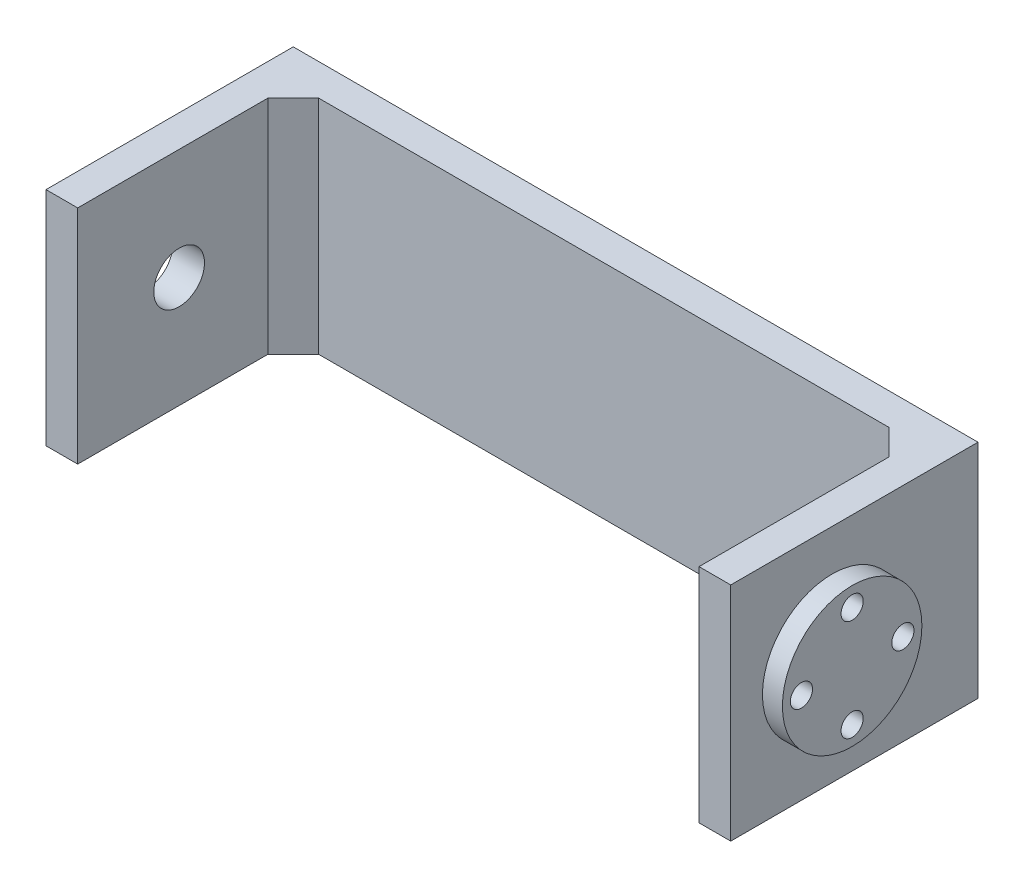
ISO-10303-21;
HEADER;
FILE_DESCRIPTION(('STEP AP214'),'2;1');
FILE_NAME('part.step','',(''),(''),'','','');
FILE_SCHEMA(('AUTOMOTIVE_DESIGN { 1 0 10303 214 1 1 1 1 }'));
ENDSEC;
DATA;
#1=APPLICATION_CONTEXT('core data for automotive mechanical design processes');
#2=APPLICATION_PROTOCOL_DEFINITION('international standard','automotive_design',2000,#1);
#3=PRODUCT_CONTEXT('',#1,'mechanical');
#4=PRODUCT('Part','Part','',(#3));
#5=PRODUCT_RELATED_PRODUCT_CATEGORY('part','',(#4));
#6=PRODUCT_DEFINITION_FORMATION('','',#4);
#7=PRODUCT_DEFINITION_CONTEXT('part definition',#1,'design');
#8=PRODUCT_DEFINITION('design','',#6,#7);
#9=PRODUCT_DEFINITION_SHAPE('','',#8);
#10=(LENGTH_UNIT() NAMED_UNIT(*) SI_UNIT(.MILLI.,.METRE.));
#11=(NAMED_UNIT(*) PLANE_ANGLE_UNIT() SI_UNIT($,.RADIAN.));
#12=(NAMED_UNIT(*) SI_UNIT($,.STERADIAN.) SOLID_ANGLE_UNIT());
#13=UNCERTAINTY_MEASURE_WITH_UNIT(LENGTH_MEASURE(1.E-05),#10,'distance_accuracy_value','');
#14=(GEOMETRIC_REPRESENTATION_CONTEXT(3) GLOBAL_UNCERTAINTY_ASSIGNED_CONTEXT((#13)) GLOBAL_UNIT_ASSIGNED_CONTEXT((#10,
#11,#12)) REPRESENTATION_CONTEXT('',''));
#15=CARTESIAN_POINT('',(0.,0.,0.));
#16=DIRECTION('',(0.,0.,1.));
#17=DIRECTION('',(1.,0.,0.));
#18=AXIS2_PLACEMENT_3D('',#15,#16,#17);
#19=CARTESIAN_POINT('',(111.15,17.5,-8.));
#20=DIRECTION('',(-1.,0.,0.));
#21=DIRECTION('',(0.,0.,1.));
#22=AXIS2_PLACEMENT_3D('',#19,#20,#21);
#23=CYLINDRICAL_SURFACE('',#22,1.75);
#24=CARTESIAN_POINT('',(111.15,17.5,-8.));
#25=DIRECTION('',(1.,0.,0.));
#26=DIRECTION('',(0.,0.,-1.));
#27=AXIS2_PLACEMENT_3D('',#24,#25,#26);
#28=CIRCLE('',#27,1.75);
#29=CARTESIAN_POINT('',(111.15,17.5,-9.75));
#30=VERTEX_POINT('',#29);
#31=EDGE_CURVE('E539',#30,#30,#28,.T.);
#32=ORIENTED_EDGE('',*,*,#31,.T.);
#33=EDGE_LOOP('',(#32));
#34=FACE_BOUND('',#33,.T.);
#35=CARTESIAN_POINT('',(105.15,17.5,-8.));
#36=DIRECTION('',(-1.,0.,0.));
#37=DIRECTION('',(0.,0.,1.));
#38=AXIS2_PLACEMENT_3D('',#35,#36,#37);
#39=CIRCLE('',#38,1.75);
#40=CARTESIAN_POINT('',(105.15,17.5,-6.25000000000001));
#41=VERTEX_POINT('',#40);
#42=EDGE_CURVE('E164',#41,#41,#39,.T.);
#43=ORIENTED_EDGE('',*,*,#42,.T.);
#44=EDGE_LOOP('',(#43));
#45=FACE_BOUND('',#44,.T.);
#46=ADVANCED_FACE('F37',(#34,#45),#23,.F.);
#47=CARTESIAN_POINT('',(111.15,25.5,-16.0000000000001));
#48=DIRECTION('',(-1.,0.,0.));
#49=DIRECTION('',(0.,0.,1.));
#50=AXIS2_PLACEMENT_3D('',#47,#48,#49);
#51=CYLINDRICAL_SURFACE('',#50,1.75);
#52=CARTESIAN_POINT('',(111.15,25.5,-16.0000000000001));
#53=DIRECTION('',(1.,0.,0.));
#54=DIRECTION('',(0.,0.,-1.));
#55=AXIS2_PLACEMENT_3D('',#52,#53,#54);
#56=CIRCLE('',#55,1.75);
#57=CARTESIAN_POINT('',(111.15,25.5,-17.7500000000001));
#58=VERTEX_POINT('',#57);
#59=EDGE_CURVE('E536',#58,#58,#56,.T.);
#60=ORIENTED_EDGE('',*,*,#59,.T.);
#61=EDGE_LOOP('',(#60));
#62=FACE_BOUND('',#61,.T.);
#63=CARTESIAN_POINT('',(105.15,25.5,-16.0000000000001));
#64=DIRECTION('',(-1.,0.,0.));
#65=DIRECTION('',(0.,0.,1.));
#66=AXIS2_PLACEMENT_3D('',#63,#64,#65);
#67=CIRCLE('',#66,1.75);
#68=CARTESIAN_POINT('',(105.15,25.5,-14.2500000000001));
#69=VERTEX_POINT('',#68);
#70=EDGE_CURVE('E159',#69,#69,#67,.T.);
#71=ORIENTED_EDGE('',*,*,#70,.T.);
#72=EDGE_LOOP('',(#71));
#73=FACE_BOUND('',#72,.T.);
#74=ADVANCED_FACE('F256',(#62,#73),#51,.F.);
#75=CARTESIAN_POINT('',(111.15,17.4999999999999,-24.));
#76=DIRECTION('',(-1.,0.,0.));
#77=DIRECTION('',(0.,0.,1.));
#78=AXIS2_PLACEMENT_3D('',#75,#76,#77);
#79=CYLINDRICAL_SURFACE('',#78,1.75);
#80=CARTESIAN_POINT('',(111.15,17.4999999999999,-24.));
#81=DIRECTION('',(1.,0.,0.));
#82=DIRECTION('',(0.,0.,-1.));
#83=AXIS2_PLACEMENT_3D('',#80,#81,#82);
#84=CIRCLE('',#83,1.75);
#85=CARTESIAN_POINT('',(111.15,17.4999999999999,-25.75));
#86=VERTEX_POINT('',#85);
#87=EDGE_CURVE('E533',#86,#86,#84,.T.);
#88=ORIENTED_EDGE('',*,*,#87,.T.);
#89=EDGE_LOOP('',(#88));
#90=FACE_BOUND('',#89,.T.);
#91=CARTESIAN_POINT('',(105.15,17.4999999999999,-24.));
#92=DIRECTION('',(-1.,0.,0.));
#93=DIRECTION('',(0.,0.,1.));
#94=AXIS2_PLACEMENT_3D('',#91,#92,#93);
#95=CIRCLE('',#94,1.75);
#96=CARTESIAN_POINT('',(105.15,17.4999999999999,-22.25));
#97=VERTEX_POINT('',#96);
#98=EDGE_CURVE('E154',#97,#97,#95,.T.);
#99=ORIENTED_EDGE('',*,*,#98,.T.);
#100=EDGE_LOOP('',(#99));
#101=FACE_BOUND('',#100,.T.);
#102=ADVANCED_FACE('F262',(#90,#101),#79,.F.);
#103=CARTESIAN_POINT('',(111.15,9.5,-16.));
#104=DIRECTION('',(-1.,0.,0.));
#105=DIRECTION('',(0.,0.,1.));
#106=AXIS2_PLACEMENT_3D('',#103,#104,#105);
#107=CYLINDRICAL_SURFACE('',#106,1.75);
#108=CARTESIAN_POINT('',(111.15,9.5,-16.));
#109=DIRECTION('',(1.,0.,0.));
#110=DIRECTION('',(0.,0.,-1.));
#111=AXIS2_PLACEMENT_3D('',#108,#109,#110);
#112=CIRCLE('',#111,1.75);
#113=CARTESIAN_POINT('',(111.15,9.5,-17.75));
#114=VERTEX_POINT('',#113);
#115=EDGE_CURVE('E152',#114,#114,#112,.T.);
#116=ORIENTED_EDGE('',*,*,#115,.T.);
#117=EDGE_LOOP('',(#116));
#118=FACE_BOUND('',#117,.T.);
#119=CARTESIAN_POINT('',(105.15,9.5,-16.));
#120=DIRECTION('',(-1.,0.,0.));
#121=DIRECTION('',(0.,0.,1.));
#122=AXIS2_PLACEMENT_3D('',#119,#120,#121);
#123=CIRCLE('',#122,1.75);
#124=CARTESIAN_POINT('',(105.15,9.5,-14.25));
#125=VERTEX_POINT('',#124);
#126=EDGE_CURVE('E149',#125,#125,#123,.T.);
#127=ORIENTED_EDGE('',*,*,#126,.T.);
#128=EDGE_LOOP('',(#127));
#129=FACE_BOUND('',#128,.T.);
#130=ADVANCED_FACE('F273',(#118,#129),#107,.F.);
#131=CARTESIAN_POINT('',(108.,35.,-39.));
#132=DIRECTION('',(-1.,0.,0.));
#133=DIRECTION('',(0.,0.,1.));
#134=AXIS2_PLACEMENT_3D('',#131,#132,#133);
#135=PLANE('',#134);
#136=DIRECTION('',(0.,0.,-1.));
#137=VECTOR('',#136,1.);
#138=CARTESIAN_POINT('',(108.,0.,-39.));
#139=LINE('',#138,#137);
#140=CARTESIAN_POINT('',(108.,0.,0.));
#141=VERTEX_POINT('',#140);
#142=CARTESIAN_POINT('',(108.,0.,-39.));
#143=VERTEX_POINT('',#142);
#144=EDGE_CURVE('E215',#141,#143,#139,.T.);
#145=ORIENTED_EDGE('',*,*,#144,.T.);
#146=DIRECTION('',(0.,-1.,0.));
#147=VECTOR('',#146,1.);
#148=CARTESIAN_POINT('',(108.,35.,-39.));
#149=LINE('',#148,#147);
#150=CARTESIAN_POINT('',(108.,35.,-39.));
#151=VERTEX_POINT('',#150);
#152=EDGE_CURVE('E224',#151,#143,#149,.T.);
#153=ORIENTED_EDGE('',*,*,#152,.F.);
#154=DIRECTION('',(0.,0.,-1.));
#155=VECTOR('',#154,1.);
#156=CARTESIAN_POINT('',(108.,35.,-39.));
#157=LINE('',#156,#155);
#158=CARTESIAN_POINT('',(108.,35.,0.));
#159=VERTEX_POINT('',#158);
#160=EDGE_CURVE('E200',#159,#151,#157,.T.);
#161=ORIENTED_EDGE('',*,*,#160,.F.);
#162=DIRECTION('',(0.,-1.,0.));
#163=VECTOR('',#162,1.);
#164=CARTESIAN_POINT('',(108.,35.,0.));
#165=LINE('',#164,#163);
#166=EDGE_CURVE('E145',#159,#141,#165,.T.);
#167=ORIENTED_EDGE('',*,*,#166,.T.);
#168=EDGE_LOOP('',(#145,#153,#161,#167));
#169=FACE_BOUND('',#168,.T.);
#170=CARTESIAN_POINT('',(108.,17.5,-16.));
#171=DIRECTION('',(-1.,0.,0.));
#172=DIRECTION('',(0.,0.,1.));
#173=AXIS2_PLACEMENT_3D('',#170,#171,#172);
#174=CIRCLE('',#173,11.);
#175=CARTESIAN_POINT('',(108.,17.5,-5.));
#176=VERTEX_POINT('',#175);
#177=EDGE_CURVE('E138',#176,#176,#174,.F.);
#178=ORIENTED_EDGE('',*,*,#177,.F.);
#179=EDGE_LOOP('',(#178));
#180=FACE_BOUND('',#179,.T.);
#181=ADVANCED_FACE('F231',(#169,#180),#135,.F.);
#182=CARTESIAN_POINT('',(5.,35.,0.));
#183=DIRECTION('',(0.,0.,-1.));
#184=DIRECTION('',(-1.,0.,0.));
#185=AXIS2_PLACEMENT_3D('',#182,#183,#184);
#186=PLANE('',#185);
#187=DIRECTION('',(1.,0.,0.));
#188=VECTOR('',#187,1.);
#189=CARTESIAN_POINT('',(5.,0.,0.));
#190=LINE('',#189,#188);
#191=CARTESIAN_POINT('',(0.,0.,0.));
#192=VERTEX_POINT('',#191);
#193=CARTESIAN_POINT('',(5.,0.,0.));
#194=VERTEX_POINT('',#193);
#195=EDGE_CURVE('E137',#192,#194,#190,.T.);
#196=ORIENTED_EDGE('',*,*,#195,.T.);
#197=DIRECTION('',(0.,-1.,0.));
#198=VECTOR('',#197,1.);
#199=CARTESIAN_POINT('',(5.,35.,0.));
#200=LINE('',#199,#198);
#201=CARTESIAN_POINT('',(5.,35.,0.));
#202=VERTEX_POINT('',#201);
#203=EDGE_CURVE('E118',#202,#194,#200,.T.);
#204=ORIENTED_EDGE('',*,*,#203,.F.);
#205=DIRECTION('',(1.,0.,0.));
#206=VECTOR('',#205,1.);
#207=CARTESIAN_POINT('',(5.,35.,0.));
#208=LINE('',#207,#206);
#209=CARTESIAN_POINT('',(0.,35.,0.));
#210=VERTEX_POINT('',#209);
#211=EDGE_CURVE('E124',#210,#202,#208,.T.);
#212=ORIENTED_EDGE('',*,*,#211,.F.);
#213=DIRECTION('',(0.,-1.,0.));
#214=VECTOR('',#213,1.);
#215=CARTESIAN_POINT('',(0.,35.,0.));
#216=LINE('',#215,#214);
#217=EDGE_CURVE('E208',#210,#192,#216,.T.);
#218=ORIENTED_EDGE('',*,*,#217,.T.);
#219=EDGE_LOOP('',(#196,#204,#212,#218));
#220=FACE_BOUND('',#219,.T.);
#221=ADVANCED_FACE('F135',(#220),#186,.F.);
#222=CARTESIAN_POINT('',(5.,35.,-34.));
#223=DIRECTION('',(-1.,0.,0.));
#224=DIRECTION('',(0.,0.,1.));
#225=AXIS2_PLACEMENT_3D('',#222,#223,#224);
#226=PLANE('',#225);
#227=CARTESIAN_POINT('',(4.99999999999999,17.5,-16.));
#228=DIRECTION('',(-1.,0.,0.));
#229=DIRECTION('',(0.,0.,1.));
#230=AXIS2_PLACEMENT_3D('',#227,#228,#229);
#231=CIRCLE('',#230,4.);
#232=CARTESIAN_POINT('',(4.99999999999999,17.5,-12.));
#233=VERTEX_POINT('',#232);
#234=EDGE_CURVE('E513',#233,#233,#231,.F.);
#235=ORIENTED_EDGE('',*,*,#234,.F.);
#236=EDGE_LOOP('',(#235));
#237=FACE_BOUND('',#236,.T.);
#238=DIRECTION('',(0.,0.,-1.));
#239=VECTOR('',#238,1.);
#240=CARTESIAN_POINT('',(5.,0.,-34.));
#241=LINE('',#240,#239);
#242=CARTESIAN_POINT('',(5.,0.,-30.));
#243=VERTEX_POINT('',#242);
#244=EDGE_CURVE('E191',#194,#243,#241,.T.);
#245=ORIENTED_EDGE('',*,*,#244,.T.);
#246=DIRECTION('',(0.,1.,0.));
#247=VECTOR('',#246,1.);
#248=CARTESIAN_POINT('',(5.,35.,-30.));
#249=LINE('',#248,#247);
#250=CARTESIAN_POINT('',(5.,35.,-30.));
#251=VERTEX_POINT('',#250);
#252=EDGE_CURVE('E121',#243,#251,#249,.T.);
#253=ORIENTED_EDGE('',*,*,#252,.T.);
#254=DIRECTION('',(0.,0.,-1.));
#255=VECTOR('',#254,1.);
#256=CARTESIAN_POINT('',(5.,35.,-34.));
#257=LINE('',#256,#255);
#258=EDGE_CURVE('E113',#202,#251,#257,.T.);
#259=ORIENTED_EDGE('',*,*,#258,.F.);
#260=ORIENTED_EDGE('',*,*,#203,.T.);
#261=EDGE_LOOP('',(#245,#253,#259,#260));
#262=FACE_BOUND('',#261,.T.);
#263=ADVANCED_FACE('F116',(#237,#262),#226,.F.);
#264=CARTESIAN_POINT('',(103.,35.,-34.));
#265=DIRECTION('',(0.,0.,-1.));
#266=DIRECTION('',(-1.,0.,0.));
#267=AXIS2_PLACEMENT_3D('',#264,#265,#266);
#268=PLANE('',#267);
#269=DIRECTION('',(1.,0.,0.));
#270=VECTOR('',#269,1.);
#271=CARTESIAN_POINT('',(103.,35.,-34.));
#272=LINE('',#271,#270);
#273=CARTESIAN_POINT('',(9.00000000000004,35.,-34.));
#274=VERTEX_POINT('',#273);
#275=CARTESIAN_POINT('',(99.,35.,-34.));
#276=VERTEX_POINT('',#275);
#277=EDGE_CURVE('E123',#274,#276,#272,.T.);
#278=ORIENTED_EDGE('',*,*,#277,.F.);
#279=DIRECTION('',(0.,-1.,0.));
#280=VECTOR('',#279,1.);
#281=CARTESIAN_POINT('',(9.00000000000004,0.,-34.));
#282=LINE('',#281,#280);
#283=CARTESIAN_POINT('',(9.00000000000004,0.,-34.));
#284=VERTEX_POINT('',#283);
#285=EDGE_CURVE('E170',#274,#284,#282,.T.);
#286=ORIENTED_EDGE('',*,*,#285,.T.);
#287=DIRECTION('',(1.,0.,0.));
#288=VECTOR('',#287,1.);
#289=CARTESIAN_POINT('',(103.,0.,-34.));
#290=LINE('',#289,#288);
#291=CARTESIAN_POINT('',(99.,0.,-34.));
#292=VERTEX_POINT('',#291);
#293=EDGE_CURVE('E184',#284,#292,#290,.T.);
#294=ORIENTED_EDGE('',*,*,#293,.T.);
#295=DIRECTION('',(0.,1.,0.));
#296=VECTOR('',#295,1.);
#297=CARTESIAN_POINT('',(99.,35.,-34.));
#298=LINE('',#297,#296);
#299=EDGE_CURVE('E142',#292,#276,#298,.T.);
#300=ORIENTED_EDGE('',*,*,#299,.T.);
#301=EDGE_LOOP('',(#278,#286,#294,#300));
#302=FACE_BOUND('',#301,.T.);
#303=ADVANCED_FACE('F189',(#302),#268,.F.);
#304=CARTESIAN_POINT('',(103.,35.,0.));
#305=DIRECTION('',(1.,0.,0.));
#306=DIRECTION('',(0.,0.,-1.));
#307=AXIS2_PLACEMENT_3D('',#304,#305,#306);
#308=PLANE('',#307);
#309=CARTESIAN_POINT('',(103.,17.5,-8.));
#310=DIRECTION('',(-1.,0.,0.));
#311=DIRECTION('',(0.,0.,1.));
#312=AXIS2_PLACEMENT_3D('',#309,#310,#311);
#313=CIRCLE('',#312,2.5);
#314=CARTESIAN_POINT('',(103.,17.5,-5.5));
#315=VERTEX_POINT('',#314);
#316=EDGE_CURVE('E510',#315,#315,#313,.T.);
#317=ORIENTED_EDGE('',*,*,#316,.F.);
#318=EDGE_LOOP('',(#317));
#319=FACE_BOUND('',#318,.T.);
#320=CARTESIAN_POINT('',(103.,25.5,-16.0000000000001));
#321=DIRECTION('',(-1.,0.,0.));
#322=DIRECTION('',(0.,0.,1.));
#323=AXIS2_PLACEMENT_3D('',#320,#321,#322);
#324=CIRCLE('',#323,2.5);
#325=CARTESIAN_POINT('',(103.,25.5,-13.5000000000001));
#326=VERTEX_POINT('',#325);
#327=EDGE_CURVE('E167',#326,#326,#324,.T.);
#328=ORIENTED_EDGE('',*,*,#327,.F.);
#329=EDGE_LOOP('',(#328));
#330=FACE_BOUND('',#329,.T.);
#331=CARTESIAN_POINT('',(103.,17.4999999999999,-24.));
#332=DIRECTION('',(-1.,0.,0.));
#333=DIRECTION('',(0.,0.,1.));
#334=AXIS2_PLACEMENT_3D('',#331,#332,#333);
#335=CIRCLE('',#334,2.5);
#336=CARTESIAN_POINT('',(103.,17.4999999999999,-21.5));
#337=VERTEX_POINT('',#336);
#338=EDGE_CURVE('E162',#337,#337,#335,.T.);
#339=ORIENTED_EDGE('',*,*,#338,.F.);
#340=EDGE_LOOP('',(#339));
#341=FACE_BOUND('',#340,.T.);
#342=CARTESIAN_POINT('',(103.,9.5,-16.));
#343=DIRECTION('',(-1.,0.,0.));
#344=DIRECTION('',(0.,0.,1.));
#345=AXIS2_PLACEMENT_3D('',#342,#343,#344);
#346=CIRCLE('',#345,2.5);
#347=CARTESIAN_POINT('',(103.,9.5,-13.5));
#348=VERTEX_POINT('',#347);
#349=EDGE_CURVE('E157',#348,#348,#346,.T.);
#350=ORIENTED_EDGE('',*,*,#349,.F.);
#351=EDGE_LOOP('',(#350));
#352=FACE_BOUND('',#351,.T.);
#353=DIRECTION('',(0.,0.,1.));
#354=VECTOR('',#353,1.);
#355=CARTESIAN_POINT('',(103.,35.,0.));
#356=LINE('',#355,#354);
#357=CARTESIAN_POINT('',(103.,35.,-30.));
#358=VERTEX_POINT('',#357);
#359=CARTESIAN_POINT('',(103.,35.,0.));
#360=VERTEX_POINT('',#359);
#361=EDGE_CURVE('E196',#358,#360,#356,.T.);
#362=ORIENTED_EDGE('',*,*,#361,.F.);
#363=DIRECTION('',(0.,-1.,0.));
#364=VECTOR('',#363,1.);
#365=CARTESIAN_POINT('',(103.,0.,-30.));
#366=LINE('',#365,#364);
#367=CARTESIAN_POINT('',(103.,0.,-30.));
#368=VERTEX_POINT('',#367);
#369=EDGE_CURVE('E174',#358,#368,#366,.T.);
#370=ORIENTED_EDGE('',*,*,#369,.T.);
#371=DIRECTION('',(0.,0.,1.));
#372=VECTOR('',#371,1.);
#373=CARTESIAN_POINT('',(103.,0.,0.));
#374=LINE('',#373,#372);
#375=CARTESIAN_POINT('',(103.,0.,0.));
#376=VERTEX_POINT('',#375);
#377=EDGE_CURVE('E186',#368,#376,#374,.T.);
#378=ORIENTED_EDGE('',*,*,#377,.T.);
#379=DIRECTION('',(0.,-1.,0.));
#380=VECTOR('',#379,1.);
#381=CARTESIAN_POINT('',(103.,35.,0.));
#382=LINE('',#381,#380);
#383=EDGE_CURVE('E139',#360,#376,#382,.T.);
#384=ORIENTED_EDGE('',*,*,#383,.F.);
#385=EDGE_LOOP('',(#362,#370,#378,#384));
#386=FACE_BOUND('',#385,.T.);
#387=ADVANCED_FACE('F194',(#319,#330,#341,#352,#386),#308,.F.);
#388=CARTESIAN_POINT('',(108.,35.,0.));
#389=DIRECTION('',(0.,0.,-1.));
#390=DIRECTION('',(-1.,0.,0.));
#391=AXIS2_PLACEMENT_3D('',#388,#389,#390);
#392=PLANE('',#391);
#393=DIRECTION('',(1.,0.,0.));
#394=VECTOR('',#393,1.);
#395=CARTESIAN_POINT('',(108.,0.,0.));
#396=LINE('',#395,#394);
#397=EDGE_CURVE('E213',#376,#141,#396,.T.);
#398=ORIENTED_EDGE('',*,*,#397,.T.);
#399=ORIENTED_EDGE('',*,*,#166,.F.);
#400=DIRECTION('',(1.,0.,0.));
#401=VECTOR('',#400,1.);
#402=CARTESIAN_POINT('',(108.,35.,0.));
#403=LINE('',#402,#401);
#404=EDGE_CURVE('E198',#360,#159,#403,.T.);
#405=ORIENTED_EDGE('',*,*,#404,.F.);
#406=ORIENTED_EDGE('',*,*,#383,.T.);
#407=EDGE_LOOP('',(#398,#399,#405,#406));
#408=FACE_BOUND('',#407,.T.);
#409=ADVANCED_FACE('F287',(#408),#392,.F.);
#410=CARTESIAN_POINT('',(0.,35.,-39.));
#411=DIRECTION('',(0.,0.,1.));
#412=DIRECTION('',(1.,0.,0.));
#413=AXIS2_PLACEMENT_3D('',#410,#411,#412);
#414=PLANE('',#413);
#415=DIRECTION('',(-1.,0.,0.));
#416=VECTOR('',#415,1.);
#417=CARTESIAN_POINT('',(0.,0.,-39.));
#418=LINE('',#417,#416);
#419=CARTESIAN_POINT('',(0.,0.,-39.));
#420=VERTEX_POINT('',#419);
#421=EDGE_CURVE('E217',#143,#420,#418,.T.);
#422=ORIENTED_EDGE('',*,*,#421,.T.);
#423=DIRECTION('',(0.,-1.,0.));
#424=VECTOR('',#423,1.);
#425=CARTESIAN_POINT('',(0.,35.,-39.));
#426=LINE('',#425,#424);
#427=CARTESIAN_POINT('',(0.,35.,-39.));
#428=VERTEX_POINT('',#427);
#429=EDGE_CURVE('E221',#428,#420,#426,.T.);
#430=ORIENTED_EDGE('',*,*,#429,.F.);
#431=DIRECTION('',(-1.,0.,0.));
#432=VECTOR('',#431,1.);
#433=CARTESIAN_POINT('',(0.,35.,-39.));
#434=LINE('',#433,#432);
#435=EDGE_CURVE('E205',#151,#428,#434,.T.);
#436=ORIENTED_EDGE('',*,*,#435,.F.);
#437=ORIENTED_EDGE('',*,*,#152,.T.);
#438=EDGE_LOOP('',(#422,#430,#436,#437));
#439=FACE_BOUND('',#438,.T.);
#440=ADVANCED_FACE('F239',(#439),#414,.F.);
#441=CARTESIAN_POINT('',(0.,35.,0.));
#442=DIRECTION('',(1.,0.,0.));
#443=DIRECTION('',(0.,0.,-1.));
#444=AXIS2_PLACEMENT_3D('',#441,#442,#443);
#445=PLANE('',#444);
#446=CARTESIAN_POINT('',(0.,17.5,-16.));
#447=DIRECTION('',(-1.,0.,0.));
#448=DIRECTION('',(0.,0.,1.));
#449=AXIS2_PLACEMENT_3D('',#446,#447,#448);
#450=CIRCLE('',#449,4.);
#451=CARTESIAN_POINT('',(0.,17.5,-12.));
#452=VERTEX_POINT('',#451);
#453=EDGE_CURVE('E516',#452,#452,#450,.T.);
#454=ORIENTED_EDGE('',*,*,#453,.F.);
#455=EDGE_LOOP('',(#454));
#456=FACE_BOUND('',#455,.T.);
#457=DIRECTION('',(0.,0.,1.));
#458=VECTOR('',#457,1.);
#459=CARTESIAN_POINT('',(0.,0.,0.));
#460=LINE('',#459,#458);
#461=EDGE_CURVE('E133',#420,#192,#460,.T.);
#462=ORIENTED_EDGE('',*,*,#461,.T.);
#463=ORIENTED_EDGE('',*,*,#217,.F.);
#464=DIRECTION('',(0.,0.,1.));
#465=VECTOR('',#464,1.);
#466=CARTESIAN_POINT('',(0.,35.,0.));
#467=LINE('',#466,#465);
#468=EDGE_CURVE('E129',#428,#210,#467,.T.);
#469=ORIENTED_EDGE('',*,*,#468,.F.);
#470=ORIENTED_EDGE('',*,*,#429,.T.);
#471=EDGE_LOOP('',(#462,#463,#469,#470));
#472=FACE_BOUND('',#471,.T.);
#473=ADVANCED_FACE('F242',(#456,#472),#445,.F.);
#474=CARTESIAN_POINT('',(0.,35.,0.));
#475=DIRECTION('',(0.,-1.,0.));
#476=DIRECTION('',(0.,0.,-1.));
#477=AXIS2_PLACEMENT_3D('',#474,#475,#476);
#478=PLANE('',#477);
#479=ORIENTED_EDGE('',*,*,#211,.T.);
#480=ORIENTED_EDGE('',*,*,#258,.T.);
#481=DIRECTION('',(-0.707106781186551,0.,0.707106781186544));
#482=VECTOR('',#481,1.);
#483=CARTESIAN_POINT('',(-12.5,35.,-12.5000000000001));
#484=LINE('',#483,#482);
#485=EDGE_CURVE('E178',#251,#274,#484,.F.);
#486=ORIENTED_EDGE('',*,*,#485,.T.);
#487=ORIENTED_EDGE('',*,*,#277,.T.);
#488=DIRECTION('',(-0.707106781186544,0.,-0.707106781186551));
#489=VECTOR('',#488,1.);
#490=CARTESIAN_POINT('',(66.5000000000005,35.,-66.4999999999998));
#491=LINE('',#490,#489);
#492=EDGE_CURVE('E11',#276,#358,#491,.F.);
#493=ORIENTED_EDGE('',*,*,#492,.T.);
#494=ORIENTED_EDGE('',*,*,#361,.T.);
#495=ORIENTED_EDGE('',*,*,#404,.T.);
#496=ORIENTED_EDGE('',*,*,#160,.T.);
#497=ORIENTED_EDGE('',*,*,#435,.T.);
#498=ORIENTED_EDGE('',*,*,#468,.T.);
#499=EDGE_LOOP('',(#479,#480,#486,#487,#493,#494,#495,#496,#497,#498));
#500=FACE_BOUND('',#499,.T.);
#501=ADVANCED_FACE('F127',(#500),#478,.F.);
#502=CARTESIAN_POINT('',(0.,0.,0.));
#503=DIRECTION('',(0.,-1.,0.));
#504=DIRECTION('',(0.,0.,-1.));
#505=AXIS2_PLACEMENT_3D('',#502,#503,#504);
#506=PLANE('',#505);
#507=ORIENTED_EDGE('',*,*,#195,.F.);
#508=ORIENTED_EDGE('',*,*,#461,.F.);
#509=ORIENTED_EDGE('',*,*,#421,.F.);
#510=ORIENTED_EDGE('',*,*,#144,.F.);
#511=ORIENTED_EDGE('',*,*,#397,.F.);
#512=ORIENTED_EDGE('',*,*,#377,.F.);
#513=DIRECTION('',(0.707106781186544,0.,0.707106781186551));
#514=VECTOR('',#513,1.);
#515=CARTESIAN_POINT('',(103.,0.,-30.));
#516=LINE('',#515,#514);
#517=EDGE_CURVE('E45',#368,#292,#516,.F.);
#518=ORIENTED_EDGE('',*,*,#517,.T.);
#519=ORIENTED_EDGE('',*,*,#293,.F.);
#520=DIRECTION('',(0.707106781186551,0.,-0.707106781186544));
#521=VECTOR('',#520,1.);
#522=CARTESIAN_POINT('',(9.00000000000004,0.,-34.));
#523=LINE('',#522,#521);
#524=EDGE_CURVE('E176',#284,#243,#523,.F.);
#525=ORIENTED_EDGE('',*,*,#524,.T.);
#526=ORIENTED_EDGE('',*,*,#244,.F.);
#527=EDGE_LOOP('',(#507,#508,#509,#510,#511,#512,#518,#519,#525,#526));
#528=FACE_BOUND('',#527,.T.);
#529=ADVANCED_FACE('F183',(#528),#506,.T.);
#530=CARTESIAN_POINT('',(111.15,17.5,-16.));
#531=DIRECTION('',(-1.,0.,0.));
#532=DIRECTION('',(0.,0.,1.));
#533=AXIS2_PLACEMENT_3D('',#530,#531,#532);
#534=CYLINDRICAL_SURFACE('',#533,11.);
#535=CARTESIAN_POINT('',(111.15,17.5,-16.));
#536=DIRECTION('',(1.,0.,0.));
#537=DIRECTION('',(0.,0.,-1.));
#538=AXIS2_PLACEMENT_3D('',#535,#536,#537);
#539=CIRCLE('',#538,11.);
#540=CARTESIAN_POINT('',(111.15,17.5,-27.));
#541=VERTEX_POINT('',#540);
#542=EDGE_CURVE('E210',#541,#541,#539,.T.);
#543=ORIENTED_EDGE('',*,*,#542,.F.);
#544=EDGE_LOOP('',(#543));
#545=FACE_BOUND('',#544,.T.);
#546=ORIENTED_EDGE('',*,*,#177,.T.);
#547=EDGE_LOOP('',(#546));
#548=FACE_BOUND('',#547,.T.);
#549=ADVANCED_FACE('F268',(#545,#548),#534,.T.);
#550=CARTESIAN_POINT('',(111.15,0.,0.));
#551=DIRECTION('',(1.,0.,0.));
#552=DIRECTION('',(0.,0.,-1.));
#553=AXIS2_PLACEMENT_3D('',#550,#551,#552);
#554=PLANE('',#553);
#555=ORIENTED_EDGE('',*,*,#115,.F.);
#556=EDGE_LOOP('',(#555));
#557=FACE_BOUND('',#556,.T.);
#558=ORIENTED_EDGE('',*,*,#87,.F.);
#559=EDGE_LOOP('',(#558));
#560=FACE_BOUND('',#559,.T.);
#561=ORIENTED_EDGE('',*,*,#59,.F.);
#562=EDGE_LOOP('',(#561));
#563=FACE_BOUND('',#562,.T.);
#564=ORIENTED_EDGE('',*,*,#31,.F.);
#565=EDGE_LOOP('',(#564));
#566=FACE_BOUND('',#565,.T.);
#567=ORIENTED_EDGE('',*,*,#542,.T.);
#568=EDGE_LOOP('',(#567));
#569=FACE_BOUND('',#568,.T.);
#570=ADVANCED_FACE('F344',(#557,#560,#563,#566,#569),#554,.T.);
#571=CARTESIAN_POINT('',(105.15,9.5,-16.));
#572=DIRECTION('',(-1.,0.,0.));
#573=DIRECTION('',(0.,0.,1.));
#574=AXIS2_PLACEMENT_3D('',#571,#572,#573);
#575=CYLINDRICAL_SURFACE('',#574,2.5);
#576=CARTESIAN_POINT('',(105.15,9.5,-16.));
#577=DIRECTION('',(-1.,0.,0.));
#578=DIRECTION('',(0.,0.,1.));
#579=AXIS2_PLACEMENT_3D('',#576,#577,#578);
#580=CIRCLE('',#579,2.5);
#581=CARTESIAN_POINT('',(105.15,9.5,-13.5));
#582=VERTEX_POINT('',#581);
#583=EDGE_CURVE('E153',#582,#582,#580,.T.);
#584=CARTESIAN_POINT('',(105.15,9.5,-13.5));
#585=CARTESIAN_POINT('',(105.127604166667,9.5,-13.5));
#586=CARTESIAN_POINT('',(105.105208333333,9.5,-13.5));
#587=CARTESIAN_POINT('',(105.060416666667,9.5,-13.5));
#588=CARTESIAN_POINT('',(105.038020833333,9.5,-13.5));
#589=CARTESIAN_POINT('',(104.993229166667,9.5,-13.5));
#590=CARTESIAN_POINT('',(104.970833333333,9.5,-13.5));
#591=CARTESIAN_POINT('',(104.926041666667,9.5,-13.5));
#592=CARTESIAN_POINT('',(104.903645833333,9.5,-13.5));
#593=CARTESIAN_POINT('',(104.858854166667,9.5,-13.5));
#594=CARTESIAN_POINT('',(104.836458333333,9.5,-13.5));
#595=CARTESIAN_POINT('',(104.791666666667,9.5,-13.5));
#596=CARTESIAN_POINT('',(104.769270833333,9.5,-13.5));
#597=CARTESIAN_POINT('',(104.724479166667,9.5,-13.5));
#598=CARTESIAN_POINT('',(104.702083333333,9.5,-13.5));
#599=CARTESIAN_POINT('',(104.657291666667,9.5,-13.5));
#600=CARTESIAN_POINT('',(104.634895833333,9.5,-13.5));
#601=CARTESIAN_POINT('',(104.590104166667,9.5,-13.5));
#602=CARTESIAN_POINT('',(104.567708333333,9.5,-13.5));
#603=CARTESIAN_POINT('',(104.522916666667,9.5,-13.5));
#604=CARTESIAN_POINT('',(104.500520833333,9.5,-13.5));
#605=CARTESIAN_POINT('',(104.455729166667,9.5,-13.5));
#606=CARTESIAN_POINT('',(104.433333333333,9.5,-13.5));
#607=CARTESIAN_POINT('',(104.388541666667,9.5,-13.5));
#608=CARTESIAN_POINT('',(104.366145833333,9.5,-13.5));
#609=CARTESIAN_POINT('',(104.321354166667,9.5,-13.5));
#610=CARTESIAN_POINT('',(104.298958333333,9.5,-13.5));
#611=CARTESIAN_POINT('',(104.254166666667,9.5,-13.5));
#612=CARTESIAN_POINT('',(104.231770833333,9.5,-13.5));
#613=CARTESIAN_POINT('',(104.186979166667,9.5,-13.5));
#614=CARTESIAN_POINT('',(104.164583333333,9.5,-13.5));
#615=CARTESIAN_POINT('',(104.119791666667,9.5,-13.5));
#616=CARTESIAN_POINT('',(104.097395833333,9.5,-13.5));
#617=CARTESIAN_POINT('',(104.052604166667,9.5,-13.5));
#618=CARTESIAN_POINT('',(104.030208333333,9.5,-13.5));
#619=CARTESIAN_POINT('',(103.985416666667,9.5,-13.5));
#620=CARTESIAN_POINT('',(103.963020833333,9.5,-13.5));
#621=CARTESIAN_POINT('',(103.918229166667,9.5,-13.5));
#622=CARTESIAN_POINT('',(103.895833333333,9.5,-13.5));
#623=CARTESIAN_POINT('',(103.851041666667,9.5,-13.5));
#624=CARTESIAN_POINT('',(103.828645833333,9.5,-13.5));
#625=CARTESIAN_POINT('',(103.783854166667,9.5,-13.5));
#626=CARTESIAN_POINT('',(103.761458333333,9.5,-13.5));
#627=CARTESIAN_POINT('',(103.716666666667,9.5,-13.5));
#628=CARTESIAN_POINT('',(103.694270833333,9.5,-13.5));
#629=CARTESIAN_POINT('',(103.649479166667,9.5,-13.5));
#630=CARTESIAN_POINT('',(103.627083333333,9.5,-13.5));
#631=CARTESIAN_POINT('',(103.582291666667,9.5,-13.5));
#632=CARTESIAN_POINT('',(103.559895833333,9.5,-13.5));
#633=CARTESIAN_POINT('',(103.515104166667,9.5,-13.5));
#634=CARTESIAN_POINT('',(103.492708333333,9.5,-13.5));
#635=CARTESIAN_POINT('',(103.447916666667,9.5,-13.5));
#636=CARTESIAN_POINT('',(103.425520833333,9.5,-13.5));
#637=CARTESIAN_POINT('',(103.380729166667,9.5,-13.5));
#638=CARTESIAN_POINT('',(103.358333333333,9.5,-13.5));
#639=CARTESIAN_POINT('',(103.313541666667,9.5,-13.5));
#640=CARTESIAN_POINT('',(103.291145833333,9.5,-13.5));
#641=CARTESIAN_POINT('',(103.246354166667,9.5,-13.5));
#642=CARTESIAN_POINT('',(103.223958333333,9.5,-13.5));
#643=CARTESIAN_POINT('',(103.179166666667,9.5,-13.5));
#644=CARTESIAN_POINT('',(103.156770833333,9.5,-13.5));
#645=CARTESIAN_POINT('',(103.111979166667,9.5,-13.5));
#646=CARTESIAN_POINT('',(103.089583333333,9.5,-13.5));
#647=CARTESIAN_POINT('',(103.044791666667,9.5,-13.5));
#648=CARTESIAN_POINT('',(103.022395833333,9.5,-13.5));
#649=CARTESIAN_POINT('',(103.,9.5,-13.5));
#650=B_SPLINE_CURVE_WITH_KNOTS('',3,(#584,#585,#586,#587,#588,#589,#590,#591,#592,#593,#594,
#595,#596,#597,#598,#599,#600,#601,#602,#603,#604,#605,#606,#607,#608,#609,#610,#611,#612,#613,
#614,#615,#616,#617,#618,#619,#620,#621,#622,#623,#624,#625,#626,#627,#628,#629,#630,#631,#632,
#633,#634,#635,#636,#637,#638,#639,#640,#641,#642,#643,#644,#645,#646,#647,#648,#649),
.UNSPECIFIED.,.F.,.F.,(4,2,2,2,2,2,2,2,2,2,2,2,2,2,2,2,2,2,2,2,2,2,2,2,2,2,2,2,2,2,2,2,4),(0.,
0.0671875000000099,0.134375000000006,0.201562500000002,0.268750000000012,0.335937500000008,
0.403125000000004,0.4703125,0.53750000000001,0.604687500000006,0.671875000000002,
0.739062500000012,0.806250000000008,0.873437500000004,0.940625,1.00781250000001,
1.07500000000001,1.1421875,1.20937500000001,1.27656250000001,1.34375,1.4109375,1.47812500000001,
1.54531250000001,1.6125,1.67968750000001,1.74687500000001,1.8140625,1.88125,1.94843750000001,
2.01562500000001,2.0828125,2.15000000000001),.UNSPECIFIED.);
#651=EDGE_CURVE('BSEAM351',#582,#348,#650,.T.);
#652=ORIENTED_EDGE('',*,*,#583,.F.);
#653=ORIENTED_EDGE('',*,*,#349,.T.);
#654=ORIENTED_EDGE('',*,*,#651,.T.);
#655=ORIENTED_EDGE('',*,*,#651,.F.);
#656=EDGE_LOOP('',(#652,#654,#653,#655));
#657=FACE_BOUND('',#656,.T.);
#658=ADVANCED_FACE('F351',(#657),#575,.F.);
#659=CARTESIAN_POINT('',(105.15,9.5,-16.));
#660=DIRECTION('',(-1.,0.,0.));
#661=DIRECTION('',(0.,0.,1.));
#662=AXIS2_PLACEMENT_3D('',#659,#660,#661);
#663=PLANE('',#662);
#664=ORIENTED_EDGE('',*,*,#126,.F.);
#665=EDGE_LOOP('',(#664));
#666=FACE_BOUND('',#665,.T.);
#667=ORIENTED_EDGE('',*,*,#583,.T.);
#668=EDGE_LOOP('',(#667));
#669=FACE_BOUND('',#668,.T.);
#670=ADVANCED_FACE('F358',(#666,#669),#663,.T.);
#671=CARTESIAN_POINT('',(105.15,17.4999999999999,-24.));
#672=DIRECTION('',(-1.,0.,0.));
#673=DIRECTION('',(0.,0.,1.));
#674=AXIS2_PLACEMENT_3D('',#671,#672,#673);
#675=CYLINDRICAL_SURFACE('',#674,2.5);
#676=CARTESIAN_POINT('',(105.15,17.4999999999999,-24.));
#677=DIRECTION('',(-1.,0.,0.));
#678=DIRECTION('',(0.,0.,1.));
#679=AXIS2_PLACEMENT_3D('',#676,#677,#678);
#680=CIRCLE('',#679,2.5);
#681=CARTESIAN_POINT('',(105.15,17.4999999999999,-21.5));
#682=VERTEX_POINT('',#681);
#683=EDGE_CURVE('E158',#682,#682,#680,.T.);
#684=CARTESIAN_POINT('',(105.15,17.4999999999999,-21.5));
#685=CARTESIAN_POINT('',(105.127604166667,17.4999999999999,-21.5));
#686=CARTESIAN_POINT('',(105.105208333333,17.4999999999999,-21.5));
#687=CARTESIAN_POINT('',(105.060416666667,17.4999999999999,-21.5));
#688=CARTESIAN_POINT('',(105.038020833333,17.4999999999999,-21.5));
#689=CARTESIAN_POINT('',(104.993229166667,17.4999999999999,-21.5));
#690=CARTESIAN_POINT('',(104.970833333333,17.4999999999999,-21.5));
#691=CARTESIAN_POINT('',(104.926041666667,17.4999999999999,-21.5));
#692=CARTESIAN_POINT('',(104.903645833333,17.4999999999999,-21.5));
#693=CARTESIAN_POINT('',(104.858854166667,17.4999999999999,-21.5));
#694=CARTESIAN_POINT('',(104.836458333333,17.4999999999999,-21.5));
#695=CARTESIAN_POINT('',(104.791666666667,17.4999999999999,-21.5));
#696=CARTESIAN_POINT('',(104.769270833333,17.4999999999999,-21.5));
#697=CARTESIAN_POINT('',(104.724479166667,17.4999999999999,-21.5));
#698=CARTESIAN_POINT('',(104.702083333333,17.4999999999999,-21.5));
#699=CARTESIAN_POINT('',(104.657291666667,17.4999999999999,-21.5));
#700=CARTESIAN_POINT('',(104.634895833333,17.4999999999999,-21.5));
#701=CARTESIAN_POINT('',(104.590104166667,17.4999999999999,-21.5));
#702=CARTESIAN_POINT('',(104.567708333333,17.4999999999999,-21.5));
#703=CARTESIAN_POINT('',(104.522916666667,17.4999999999999,-21.5));
#704=CARTESIAN_POINT('',(104.500520833333,17.4999999999999,-21.5));
#705=CARTESIAN_POINT('',(104.455729166667,17.4999999999999,-21.5));
#706=CARTESIAN_POINT('',(104.433333333333,17.4999999999999,-21.5));
#707=CARTESIAN_POINT('',(104.388541666667,17.4999999999999,-21.5));
#708=CARTESIAN_POINT('',(104.366145833333,17.4999999999999,-21.5));
#709=CARTESIAN_POINT('',(104.321354166667,17.4999999999999,-21.5));
#710=CARTESIAN_POINT('',(104.298958333333,17.4999999999999,-21.5));
#711=CARTESIAN_POINT('',(104.254166666667,17.4999999999999,-21.5));
#712=CARTESIAN_POINT('',(104.231770833333,17.4999999999999,-21.5));
#713=CARTESIAN_POINT('',(104.186979166667,17.4999999999999,-21.5));
#714=CARTESIAN_POINT('',(104.164583333333,17.4999999999999,-21.5));
#715=CARTESIAN_POINT('',(104.119791666667,17.4999999999999,-21.5));
#716=CARTESIAN_POINT('',(104.097395833333,17.4999999999999,-21.5));
#717=CARTESIAN_POINT('',(104.052604166667,17.4999999999999,-21.5));
#718=CARTESIAN_POINT('',(104.030208333333,17.4999999999999,-21.5));
#719=CARTESIAN_POINT('',(103.985416666667,17.4999999999999,-21.5));
#720=CARTESIAN_POINT('',(103.963020833333,17.4999999999999,-21.5));
#721=CARTESIAN_POINT('',(103.918229166667,17.4999999999999,-21.5));
#722=CARTESIAN_POINT('',(103.895833333333,17.4999999999999,-21.5));
#723=CARTESIAN_POINT('',(103.851041666667,17.4999999999999,-21.5));
#724=CARTESIAN_POINT('',(103.828645833333,17.4999999999999,-21.5));
#725=CARTESIAN_POINT('',(103.783854166667,17.4999999999999,-21.5));
#726=CARTESIAN_POINT('',(103.761458333333,17.4999999999999,-21.5));
#727=CARTESIAN_POINT('',(103.716666666667,17.4999999999999,-21.5));
#728=CARTESIAN_POINT('',(103.694270833333,17.4999999999999,-21.5));
#729=CARTESIAN_POINT('',(103.649479166667,17.4999999999999,-21.5));
#730=CARTESIAN_POINT('',(103.627083333333,17.4999999999999,-21.5));
#731=CARTESIAN_POINT('',(103.582291666667,17.4999999999999,-21.5));
#732=CARTESIAN_POINT('',(103.559895833333,17.4999999999999,-21.5));
#733=CARTESIAN_POINT('',(103.515104166667,17.4999999999999,-21.5));
#734=CARTESIAN_POINT('',(103.492708333333,17.4999999999999,-21.5));
#735=CARTESIAN_POINT('',(103.447916666667,17.4999999999999,-21.5));
#736=CARTESIAN_POINT('',(103.425520833333,17.4999999999999,-21.5));
#737=CARTESIAN_POINT('',(103.380729166667,17.4999999999999,-21.5));
#738=CARTESIAN_POINT('',(103.358333333333,17.4999999999999,-21.5));
#739=CARTESIAN_POINT('',(103.313541666667,17.4999999999999,-21.5));
#740=CARTESIAN_POINT('',(103.291145833333,17.4999999999999,-21.5));
#741=CARTESIAN_POINT('',(103.246354166667,17.4999999999999,-21.5));
#742=CARTESIAN_POINT('',(103.223958333333,17.4999999999999,-21.5));
#743=CARTESIAN_POINT('',(103.179166666667,17.4999999999999,-21.5));
#744=CARTESIAN_POINT('',(103.156770833333,17.4999999999999,-21.5));
#745=CARTESIAN_POINT('',(103.111979166667,17.4999999999999,-21.5));
#746=CARTESIAN_POINT('',(103.089583333333,17.4999999999999,-21.5));
#747=CARTESIAN_POINT('',(103.044791666667,17.4999999999999,-21.5));
#748=CARTESIAN_POINT('',(103.022395833333,17.4999999999999,-21.5));
#749=CARTESIAN_POINT('',(103.,17.4999999999999,-21.5));
#750=B_SPLINE_CURVE_WITH_KNOTS('',3,(#684,#685,#686,#687,#688,#689,#690,#691,#692,#693,#694,
#695,#696,#697,#698,#699,#700,#701,#702,#703,#704,#705,#706,#707,#708,#709,#710,#711,#712,#713,
#714,#715,#716,#717,#718,#719,#720,#721,#722,#723,#724,#725,#726,#727,#728,#729,#730,#731,#732,
#733,#734,#735,#736,#737,#738,#739,#740,#741,#742,#743,#744,#745,#746,#747,#748,#749),
.UNSPECIFIED.,.F.,.F.,(4,2,2,2,2,2,2,2,2,2,2,2,2,2,2,2,2,2,2,2,2,2,2,2,2,2,2,2,2,2,2,2,4),(0.,
0.0671875000000099,0.134375000000006,0.201562500000002,0.268750000000012,0.335937500000008,
0.403125000000004,0.4703125,0.53750000000001,0.604687500000006,0.671875000000002,
0.739062500000012,0.806250000000008,0.873437500000004,0.940625,1.00781250000001,
1.07500000000001,1.1421875,1.20937500000001,1.27656250000001,1.34375,1.4109375,1.47812500000001,
1.54531250000001,1.6125,1.67968750000001,1.74687500000001,1.8140625,1.88125,1.94843750000001,
2.01562500000001,2.0828125,2.15000000000001),.UNSPECIFIED.);
#751=EDGE_CURVE('BSEAM367',#682,#337,#750,.T.);
#752=ORIENTED_EDGE('',*,*,#683,.F.);
#753=ORIENTED_EDGE('',*,*,#338,.T.);
#754=ORIENTED_EDGE('',*,*,#751,.T.);
#755=ORIENTED_EDGE('',*,*,#751,.F.);
#756=EDGE_LOOP('',(#752,#754,#753,#755));
#757=FACE_BOUND('',#756,.T.);
#758=ADVANCED_FACE('F367',(#757),#675,.F.);
#759=CARTESIAN_POINT('',(105.15,17.4999999999999,-24.));
#760=DIRECTION('',(-1.,0.,0.));
#761=DIRECTION('',(0.,0.,1.));
#762=AXIS2_PLACEMENT_3D('',#759,#760,#761);
#763=PLANE('',#762);
#764=ORIENTED_EDGE('',*,*,#98,.F.);
#765=EDGE_LOOP('',(#764));
#766=FACE_BOUND('',#765,.T.);
#767=ORIENTED_EDGE('',*,*,#683,.T.);
#768=EDGE_LOOP('',(#767));
#769=FACE_BOUND('',#768,.T.);
#770=ADVANCED_FACE('F375',(#766,#769),#763,.T.);
#771=CARTESIAN_POINT('',(105.15,25.5,-16.0000000000001));
#772=DIRECTION('',(-1.,0.,0.));
#773=DIRECTION('',(0.,0.,1.));
#774=AXIS2_PLACEMENT_3D('',#771,#772,#773);
#775=CYLINDRICAL_SURFACE('',#774,2.5);
#776=CARTESIAN_POINT('',(105.15,25.5,-16.0000000000001));
#777=DIRECTION('',(-1.,0.,0.));
#778=DIRECTION('',(0.,0.,1.));
#779=AXIS2_PLACEMENT_3D('',#776,#777,#778);
#780=CIRCLE('',#779,2.5);
#781=CARTESIAN_POINT('',(105.15,25.5,-13.5000000000001));
#782=VERTEX_POINT('',#781);
#783=EDGE_CURVE('E163',#782,#782,#780,.T.);
#784=CARTESIAN_POINT('',(105.15,25.5,-13.5000000000001));
#785=CARTESIAN_POINT('',(105.127604166667,25.5,-13.5000000000001));
#786=CARTESIAN_POINT('',(105.105208333333,25.5,-13.5000000000001));
#787=CARTESIAN_POINT('',(105.060416666667,25.5,-13.5000000000001));
#788=CARTESIAN_POINT('',(105.038020833333,25.5,-13.5000000000001));
#789=CARTESIAN_POINT('',(104.993229166667,25.5,-13.5000000000001));
#790=CARTESIAN_POINT('',(104.970833333333,25.5,-13.5000000000001));
#791=CARTESIAN_POINT('',(104.926041666667,25.5,-13.5000000000001));
#792=CARTESIAN_POINT('',(104.903645833333,25.5,-13.5000000000001));
#793=CARTESIAN_POINT('',(104.858854166667,25.5,-13.5000000000001));
#794=CARTESIAN_POINT('',(104.836458333333,25.5,-13.5000000000001));
#795=CARTESIAN_POINT('',(104.791666666667,25.5,-13.5000000000001));
#796=CARTESIAN_POINT('',(104.769270833333,25.5,-13.5000000000001));
#797=CARTESIAN_POINT('',(104.724479166667,25.5,-13.5000000000001));
#798=CARTESIAN_POINT('',(104.702083333333,25.5,-13.5000000000001));
#799=CARTESIAN_POINT('',(104.657291666667,25.5,-13.5000000000001));
#800=CARTESIAN_POINT('',(104.634895833333,25.5,-13.5000000000001));
#801=CARTESIAN_POINT('',(104.590104166667,25.5,-13.5000000000001));
#802=CARTESIAN_POINT('',(104.567708333333,25.5,-13.5000000000001));
#803=CARTESIAN_POINT('',(104.522916666667,25.5,-13.5000000000001));
#804=CARTESIAN_POINT('',(104.500520833333,25.5,-13.5000000000001));
#805=CARTESIAN_POINT('',(104.455729166667,25.5,-13.5000000000001));
#806=CARTESIAN_POINT('',(104.433333333333,25.5,-13.5000000000001));
#807=CARTESIAN_POINT('',(104.388541666667,25.5,-13.5000000000001));
#808=CARTESIAN_POINT('',(104.366145833333,25.5,-13.5000000000001));
#809=CARTESIAN_POINT('',(104.321354166667,25.5,-13.5000000000001));
#810=CARTESIAN_POINT('',(104.298958333333,25.5,-13.5000000000001));
#811=CARTESIAN_POINT('',(104.254166666667,25.5,-13.5000000000001));
#812=CARTESIAN_POINT('',(104.231770833333,25.5,-13.5000000000001));
#813=CARTESIAN_POINT('',(104.186979166667,25.5,-13.5000000000001));
#814=CARTESIAN_POINT('',(104.164583333333,25.5,-13.5000000000001));
#815=CARTESIAN_POINT('',(104.119791666667,25.5,-13.5000000000001));
#816=CARTESIAN_POINT('',(104.097395833333,25.5,-13.5000000000001));
#817=CARTESIAN_POINT('',(104.052604166667,25.5,-13.5000000000001));
#818=CARTESIAN_POINT('',(104.030208333333,25.5,-13.5000000000001));
#819=CARTESIAN_POINT('',(103.985416666667,25.5,-13.5000000000001));
#820=CARTESIAN_POINT('',(103.963020833333,25.5,-13.5000000000001));
#821=CARTESIAN_POINT('',(103.918229166667,25.5,-13.5000000000001));
#822=CARTESIAN_POINT('',(103.895833333333,25.5,-13.5000000000001));
#823=CARTESIAN_POINT('',(103.851041666667,25.5,-13.5000000000001));
#824=CARTESIAN_POINT('',(103.828645833333,25.5,-13.5000000000001));
#825=CARTESIAN_POINT('',(103.783854166667,25.5,-13.5000000000001));
#826=CARTESIAN_POINT('',(103.761458333333,25.5,-13.5000000000001));
#827=CARTESIAN_POINT('',(103.716666666667,25.5,-13.5000000000001));
#828=CARTESIAN_POINT('',(103.694270833333,25.5,-13.5000000000001));
#829=CARTESIAN_POINT('',(103.649479166667,25.5,-13.5000000000001));
#830=CARTESIAN_POINT('',(103.627083333333,25.5,-13.5000000000001));
#831=CARTESIAN_POINT('',(103.582291666667,25.5,-13.5000000000001));
#832=CARTESIAN_POINT('',(103.559895833333,25.5,-13.5000000000001));
#833=CARTESIAN_POINT('',(103.515104166667,25.5,-13.5000000000001));
#834=CARTESIAN_POINT('',(103.492708333333,25.5,-13.5000000000001));
#835=CARTESIAN_POINT('',(103.447916666667,25.5,-13.5000000000001));
#836=CARTESIAN_POINT('',(103.425520833333,25.5,-13.5000000000001));
#837=CARTESIAN_POINT('',(103.380729166667,25.5,-13.5000000000001));
#838=CARTESIAN_POINT('',(103.358333333333,25.5,-13.5000000000001));
#839=CARTESIAN_POINT('',(103.313541666667,25.5,-13.5000000000001));
#840=CARTESIAN_POINT('',(103.291145833333,25.5,-13.5000000000001));
#841=CARTESIAN_POINT('',(103.246354166667,25.5,-13.5000000000001));
#842=CARTESIAN_POINT('',(103.223958333333,25.5,-13.5000000000001));
#843=CARTESIAN_POINT('',(103.179166666667,25.5,-13.5000000000001));
#844=CARTESIAN_POINT('',(103.156770833333,25.5,-13.5000000000001));
#845=CARTESIAN_POINT('',(103.111979166667,25.5,-13.5000000000001));
#846=CARTESIAN_POINT('',(103.089583333333,25.5,-13.5000000000001));
#847=CARTESIAN_POINT('',(103.044791666667,25.5,-13.5000000000001));
#848=CARTESIAN_POINT('',(103.022395833333,25.5,-13.5000000000001));
#849=CARTESIAN_POINT('',(103.,25.5,-13.5000000000001));
#850=B_SPLINE_CURVE_WITH_KNOTS('',3,(#784,#785,#786,#787,#788,#789,#790,#791,#792,#793,#794,
#795,#796,#797,#798,#799,#800,#801,#802,#803,#804,#805,#806,#807,#808,#809,#810,#811,#812,#813,
#814,#815,#816,#817,#818,#819,#820,#821,#822,#823,#824,#825,#826,#827,#828,#829,#830,#831,#832,
#833,#834,#835,#836,#837,#838,#839,#840,#841,#842,#843,#844,#845,#846,#847,#848,#849),
.UNSPECIFIED.,.F.,.F.,(4,2,2,2,2,2,2,2,2,2,2,2,2,2,2,2,2,2,2,2,2,2,2,2,2,2,2,2,2,2,2,2,4),(0.,
0.0671875000000099,0.134375000000006,0.201562500000002,0.268750000000012,0.335937500000008,
0.403125000000004,0.4703125,0.53750000000001,0.604687500000006,0.671875000000002,
0.739062500000012,0.806250000000008,0.873437500000004,0.940625,1.00781250000001,
1.07500000000001,1.1421875,1.20937500000001,1.27656250000001,1.34375,1.4109375,1.47812500000001,
1.54531250000001,1.6125,1.67968750000001,1.74687500000001,1.8140625,1.88125,1.94843750000001,
2.01562500000001,2.0828125,2.15000000000001),.UNSPECIFIED.);
#851=EDGE_CURVE('BSEAM383',#782,#326,#850,.T.);
#852=ORIENTED_EDGE('',*,*,#783,.F.);
#853=ORIENTED_EDGE('',*,*,#327,.T.);
#854=ORIENTED_EDGE('',*,*,#851,.T.);
#855=ORIENTED_EDGE('',*,*,#851,.F.);
#856=EDGE_LOOP('',(#852,#854,#853,#855));
#857=FACE_BOUND('',#856,.T.);
#858=ADVANCED_FACE('F383',(#857),#775,.F.);
#859=CARTESIAN_POINT('',(105.15,25.5,-16.0000000000001));
#860=DIRECTION('',(-1.,0.,0.));
#861=DIRECTION('',(0.,0.,1.));
#862=AXIS2_PLACEMENT_3D('',#859,#860,#861);
#863=PLANE('',#862);
#864=ORIENTED_EDGE('',*,*,#70,.F.);
#865=EDGE_LOOP('',(#864));
#866=FACE_BOUND('',#865,.T.);
#867=ORIENTED_EDGE('',*,*,#783,.T.);
#868=EDGE_LOOP('',(#867));
#869=FACE_BOUND('',#868,.T.);
#870=ADVANCED_FACE('F391',(#866,#869),#863,.T.);
#871=CARTESIAN_POINT('',(105.15,17.5,-8.));
#872=DIRECTION('',(-1.,0.,0.));
#873=DIRECTION('',(0.,0.,1.));
#874=AXIS2_PLACEMENT_3D('',#871,#872,#873);
#875=CYLINDRICAL_SURFACE('',#874,2.5);
#876=CARTESIAN_POINT('',(105.15,17.5,-8.));
#877=DIRECTION('',(-1.,0.,0.));
#878=DIRECTION('',(0.,0.,1.));
#879=AXIS2_PLACEMENT_3D('',#876,#877,#878);
#880=CIRCLE('',#879,2.5);
#881=CARTESIAN_POINT('',(105.15,17.5,-5.5));
#882=VERTEX_POINT('',#881);
#883=EDGE_CURVE('E168',#882,#882,#880,.T.);
#884=CARTESIAN_POINT('',(105.15,17.5,-5.5));
#885=CARTESIAN_POINT('',(105.127604166667,17.5,-5.5));
#886=CARTESIAN_POINT('',(105.105208333333,17.5,-5.5));
#887=CARTESIAN_POINT('',(105.060416666667,17.5,-5.5));
#888=CARTESIAN_POINT('',(105.038020833333,17.5,-5.5));
#889=CARTESIAN_POINT('',(104.993229166667,17.5,-5.5));
#890=CARTESIAN_POINT('',(104.970833333333,17.5,-5.5));
#891=CARTESIAN_POINT('',(104.926041666667,17.5,-5.5));
#892=CARTESIAN_POINT('',(104.903645833333,17.5,-5.5));
#893=CARTESIAN_POINT('',(104.858854166667,17.5,-5.5));
#894=CARTESIAN_POINT('',(104.836458333333,17.5,-5.5));
#895=CARTESIAN_POINT('',(104.791666666667,17.5,-5.5));
#896=CARTESIAN_POINT('',(104.769270833333,17.5,-5.5));
#897=CARTESIAN_POINT('',(104.724479166667,17.5,-5.5));
#898=CARTESIAN_POINT('',(104.702083333333,17.5,-5.5));
#899=CARTESIAN_POINT('',(104.657291666667,17.5,-5.5));
#900=CARTESIAN_POINT('',(104.634895833333,17.5,-5.5));
#901=CARTESIAN_POINT('',(104.590104166667,17.5,-5.5));
#902=CARTESIAN_POINT('',(104.567708333333,17.5,-5.5));
#903=CARTESIAN_POINT('',(104.522916666667,17.5,-5.5));
#904=CARTESIAN_POINT('',(104.500520833333,17.5,-5.5));
#905=CARTESIAN_POINT('',(104.455729166667,17.5,-5.5));
#906=CARTESIAN_POINT('',(104.433333333333,17.5,-5.5));
#907=CARTESIAN_POINT('',(104.388541666667,17.5,-5.5));
#908=CARTESIAN_POINT('',(104.366145833333,17.5,-5.5));
#909=CARTESIAN_POINT('',(104.321354166667,17.5,-5.5));
#910=CARTESIAN_POINT('',(104.298958333333,17.5,-5.5));
#911=CARTESIAN_POINT('',(104.254166666667,17.5,-5.5));
#912=CARTESIAN_POINT('',(104.231770833333,17.5,-5.5));
#913=CARTESIAN_POINT('',(104.186979166667,17.5,-5.5));
#914=CARTESIAN_POINT('',(104.164583333333,17.5,-5.5));
#915=CARTESIAN_POINT('',(104.119791666667,17.5,-5.5));
#916=CARTESIAN_POINT('',(104.097395833333,17.5,-5.5));
#917=CARTESIAN_POINT('',(104.052604166667,17.5,-5.5));
#918=CARTESIAN_POINT('',(104.030208333333,17.5,-5.5));
#919=CARTESIAN_POINT('',(103.985416666667,17.5,-5.5));
#920=CARTESIAN_POINT('',(103.963020833333,17.5,-5.5));
#921=CARTESIAN_POINT('',(103.918229166667,17.5,-5.5));
#922=CARTESIAN_POINT('',(103.895833333333,17.5,-5.5));
#923=CARTESIAN_POINT('',(103.851041666667,17.5,-5.5));
#924=CARTESIAN_POINT('',(103.828645833333,17.5,-5.5));
#925=CARTESIAN_POINT('',(103.783854166667,17.5,-5.5));
#926=CARTESIAN_POINT('',(103.761458333333,17.5,-5.5));
#927=CARTESIAN_POINT('',(103.716666666667,17.5,-5.5));
#928=CARTESIAN_POINT('',(103.694270833333,17.5,-5.5));
#929=CARTESIAN_POINT('',(103.649479166667,17.5,-5.5));
#930=CARTESIAN_POINT('',(103.627083333333,17.5,-5.5));
#931=CARTESIAN_POINT('',(103.582291666667,17.5,-5.5));
#932=CARTESIAN_POINT('',(103.559895833333,17.5,-5.5));
#933=CARTESIAN_POINT('',(103.515104166667,17.5,-5.5));
#934=CARTESIAN_POINT('',(103.492708333333,17.5,-5.5));
#935=CARTESIAN_POINT('',(103.447916666667,17.5,-5.5));
#936=CARTESIAN_POINT('',(103.425520833333,17.5,-5.5));
#937=CARTESIAN_POINT('',(103.380729166667,17.5,-5.5));
#938=CARTESIAN_POINT('',(103.358333333333,17.5,-5.5));
#939=CARTESIAN_POINT('',(103.313541666667,17.5,-5.5));
#940=CARTESIAN_POINT('',(103.291145833333,17.5,-5.5));
#941=CARTESIAN_POINT('',(103.246354166667,17.5,-5.5));
#942=CARTESIAN_POINT('',(103.223958333333,17.5,-5.5));
#943=CARTESIAN_POINT('',(103.179166666667,17.5,-5.5));
#944=CARTESIAN_POINT('',(103.156770833333,17.5,-5.5));
#945=CARTESIAN_POINT('',(103.111979166667,17.5,-5.5));
#946=CARTESIAN_POINT('',(103.089583333333,17.5,-5.5));
#947=CARTESIAN_POINT('',(103.044791666667,17.5,-5.5));
#948=CARTESIAN_POINT('',(103.022395833333,17.5,-5.5));
#949=CARTESIAN_POINT('',(103.,17.5,-5.5));
#950=B_SPLINE_CURVE_WITH_KNOTS('',3,(#884,#885,#886,#887,#888,#889,#890,#891,#892,#893,#894,
#895,#896,#897,#898,#899,#900,#901,#902,#903,#904,#905,#906,#907,#908,#909,#910,#911,#912,#913,
#914,#915,#916,#917,#918,#919,#920,#921,#922,#923,#924,#925,#926,#927,#928,#929,#930,#931,#932,
#933,#934,#935,#936,#937,#938,#939,#940,#941,#942,#943,#944,#945,#946,#947,#948,#949),
.UNSPECIFIED.,.F.,.F.,(4,2,2,2,2,2,2,2,2,2,2,2,2,2,2,2,2,2,2,2,2,2,2,2,2,2,2,2,2,2,2,2,4),(0.,
0.0671875000000099,0.134375000000006,0.201562500000002,0.268750000000012,0.335937500000008,
0.403125000000004,0.4703125,0.53750000000001,0.604687500000006,0.671875000000002,
0.739062500000012,0.806250000000008,0.873437500000004,0.940625,1.00781250000001,
1.07500000000001,1.1421875,1.20937500000001,1.27656250000001,1.34375,1.4109375,1.47812500000001,
1.54531250000001,1.6125,1.67968750000001,1.74687500000001,1.8140625,1.88125,1.94843750000001,
2.01562500000001,2.0828125,2.15000000000001),.UNSPECIFIED.);
#951=EDGE_CURVE('BSEAM399',#882,#315,#950,.T.);
#952=ORIENTED_EDGE('',*,*,#883,.F.);
#953=ORIENTED_EDGE('',*,*,#316,.T.);
#954=ORIENTED_EDGE('',*,*,#951,.T.);
#955=ORIENTED_EDGE('',*,*,#951,.F.);
#956=EDGE_LOOP('',(#952,#954,#953,#955));
#957=FACE_BOUND('',#956,.T.);
#958=ADVANCED_FACE('F399',(#957),#875,.F.);
#959=CARTESIAN_POINT('',(105.15,17.5,-8.));
#960=DIRECTION('',(-1.,0.,0.));
#961=DIRECTION('',(0.,0.,1.));
#962=AXIS2_PLACEMENT_3D('',#959,#960,#961);
#963=PLANE('',#962);
#964=ORIENTED_EDGE('',*,*,#42,.F.);
#965=EDGE_LOOP('',(#964));
#966=FACE_BOUND('',#965,.T.);
#967=ORIENTED_EDGE('',*,*,#883,.T.);
#968=EDGE_LOOP('',(#967));
#969=FACE_BOUND('',#968,.T.);
#970=ADVANCED_FACE('F251',(#966,#969),#963,.T.);
#971=CARTESIAN_POINT('',(111.151,17.5,-16.));
#972=DIRECTION('',(-1.,0.,0.));
#973=DIRECTION('',(0.,0.,1.));
#974=AXIS2_PLACEMENT_3D('',#971,#972,#973);
#975=CYLINDRICAL_SURFACE('',#974,4.);
#976=ORIENTED_EDGE('',*,*,#453,.T.);
#977=EDGE_LOOP('',(#976));
#978=FACE_BOUND('',#977,.T.);
#979=ORIENTED_EDGE('',*,*,#234,.T.);
#980=EDGE_LOOP('',(#979));
#981=FACE_BOUND('',#980,.T.);
#982=ADVANCED_FACE('F246',(#978,#981),#975,.F.);
#983=CARTESIAN_POINT('',(9.00000000000004,35.,-34.));
#984=DIRECTION('',(0.707106781186544,0.,0.707106781186551));
#985=DIRECTION('',(0.,1.,0.));
#986=AXIS2_PLACEMENT_3D('',#983,#984,#985);
#987=PLANE('',#986);
#988=ORIENTED_EDGE('',*,*,#485,.F.);
#989=ORIENTED_EDGE('',*,*,#252,.F.);
#990=ORIENTED_EDGE('',*,*,#524,.F.);
#991=ORIENTED_EDGE('',*,*,#285,.F.);
#992=EDGE_LOOP('',(#988,#989,#990,#991));
#993=FACE_BOUND('',#992,.T.);
#994=ADVANCED_FACE('F244',(#993),#987,.T.);
#995=CARTESIAN_POINT('',(103.,35.,-30.));
#996=DIRECTION('',(-0.707106781186551,0.,0.707106781186544));
#997=DIRECTION('',(0.,1.,0.));
#998=AXIS2_PLACEMENT_3D('',#995,#996,#997);
#999=PLANE('',#998);
#1000=ORIENTED_EDGE('',*,*,#492,.F.);
#1001=ORIENTED_EDGE('',*,*,#299,.F.);
#1002=ORIENTED_EDGE('',*,*,#517,.F.);
#1003=ORIENTED_EDGE('',*,*,#369,.F.);
#1004=EDGE_LOOP('',(#1000,#1001,#1002,#1003));
#1005=FACE_BOUND('',#1004,.T.);
#1006=ADVANCED_FACE('F39',(#1005),#999,.T.);
#1007=CLOSED_SHELL('',(#46,#74,#102,#130,#181,#221,#263,#303,#387,#409,#440,#473,#501,#529,#549,
#570,#658,#670,#758,#770,#858,#870,#958,#970,#982,#994,#1006));
#1008=MANIFOLD_SOLID_BREP('B2',#1007);
#1009=ADVANCED_BREP_SHAPE_REPRESENTATION('',(#18,#1008),#14);
#1010=SHAPE_DEFINITION_REPRESENTATION(#9,#1009);
ENDSEC;
END-ISO-10303-21;
